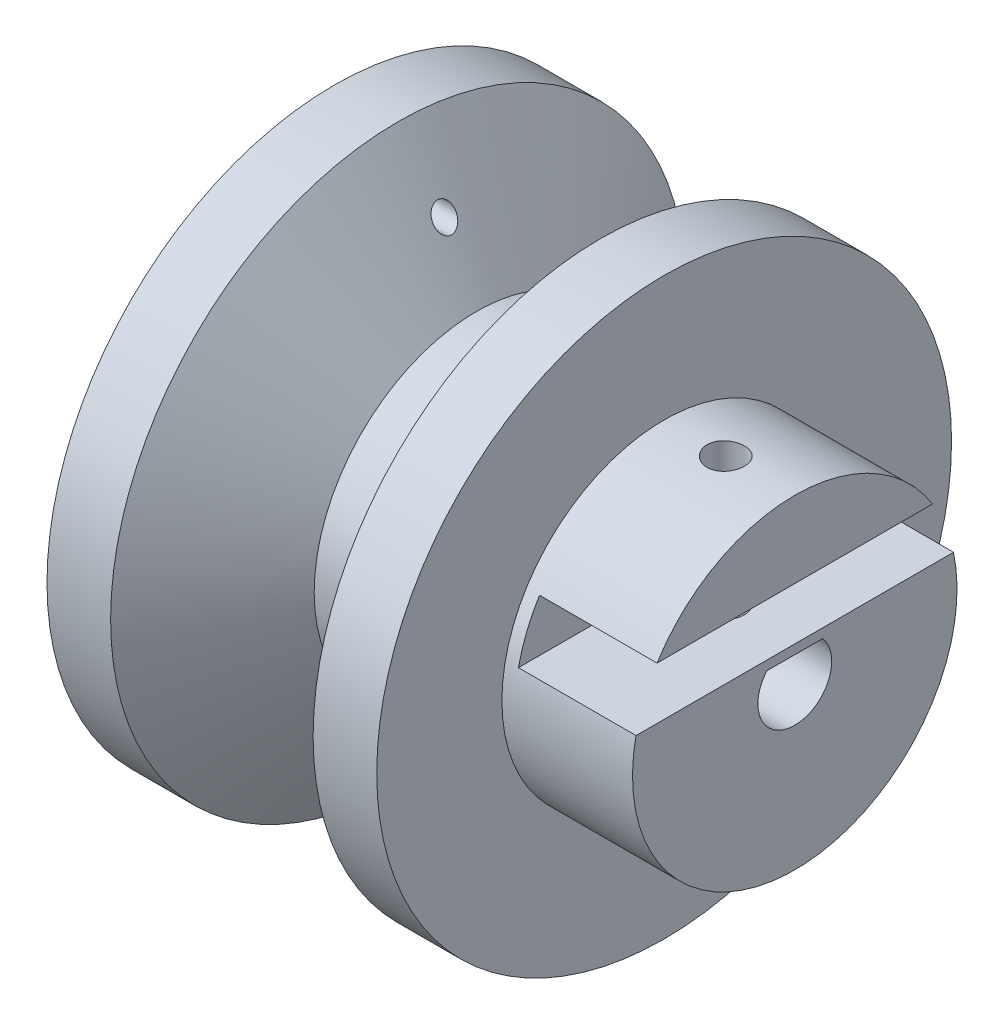
ISO-10303-21;
HEADER;
FILE_DESCRIPTION(('STEP AP214'),'2;1');
FILE_NAME('part.step','',(''),(''),'','','');
FILE_SCHEMA(('AUTOMOTIVE_DESIGN { 1 0 10303 214 1 1 1 1 }'));
ENDSEC;
DATA;
#1=APPLICATION_CONTEXT('core data for automotive mechanical design processes');
#2=APPLICATION_PROTOCOL_DEFINITION('international standard','automotive_design',2000,#1);
#3=PRODUCT_CONTEXT('',#1,'mechanical');
#4=PRODUCT('Part','Part','',(#3));
#5=PRODUCT_RELATED_PRODUCT_CATEGORY('part','',(#4));
#6=PRODUCT_DEFINITION_FORMATION('','',#4);
#7=PRODUCT_DEFINITION_CONTEXT('part definition',#1,'design');
#8=PRODUCT_DEFINITION('design','',#6,#7);
#9=PRODUCT_DEFINITION_SHAPE('','',#8);
#10=(LENGTH_UNIT() NAMED_UNIT(*) SI_UNIT(.MILLI.,.METRE.));
#11=(NAMED_UNIT(*) PLANE_ANGLE_UNIT() SI_UNIT($,.RADIAN.));
#12=(NAMED_UNIT(*) SI_UNIT($,.STERADIAN.) SOLID_ANGLE_UNIT());
#13=UNCERTAINTY_MEASURE_WITH_UNIT(LENGTH_MEASURE(1.E-05),#10,'distance_accuracy_value','');
#14=(GEOMETRIC_REPRESENTATION_CONTEXT(3) GLOBAL_UNCERTAINTY_ASSIGNED_CONTEXT((#13)) GLOBAL_UNIT_ASSIGNED_CONTEXT((#10,
#11,#12)) REPRESENTATION_CONTEXT('',''));
#15=CARTESIAN_POINT('',(0.,0.,0.));
#16=DIRECTION('',(0.,0.,1.));
#17=DIRECTION('',(1.,0.,0.));
#18=AXIS2_PLACEMENT_3D('',#15,#16,#17);
#19=CARTESIAN_POINT('',(35.24,12.4188584474886,0.));
#20=DIRECTION('',(-1.,0.,0.));
#21=DIRECTION('',(0.,0.,1.));
#22=AXIS2_PLACEMENT_3D('',#19,#20,#21);
#23=PLANE('',#22);
#24=DIRECTION('',(0.,0.,-1.));
#25=VECTOR('',#24,1.);
#26=CARTESIAN_POINT('',(35.24,1.85097792377277,2.60998384332674));
#27=LINE('',#26,#25);
#28=CARTESIAN_POINT('',(35.24,1.85097792377277,2.13412879782497));
#29=VERTEX_POINT('',#28);
#30=CARTESIAN_POINT('',(35.24,1.85097792377277,-2.13412879782497));
#31=VERTEX_POINT('',#30);
#32=EDGE_CURVE('E115',#29,#31,#27,.T.);
#33=ORIENTED_EDGE('',*,*,#32,.T.);
#34=CARTESIAN_POINT('',(35.24,0.,0.));
#35=DIRECTION('',(1.,0.,0.));
#36=DIRECTION('',(0.,0.,-1.));
#37=AXIS2_PLACEMENT_3D('',#34,#35,#36);
#38=CIRCLE('',#37,2.825);
#39=EDGE_CURVE('E128',#29,#31,#38,.T.);
#40=ORIENTED_EDGE('',*,*,#39,.F.);
#41=EDGE_LOOP('',(#33,#40));
#42=FACE_BOUND('',#41,.T.);
#43=CARTESIAN_POINT('',(35.2400000000001,0.,0.));
#44=DIRECTION('',(-1.,0.,0.));
#45=DIRECTION('',(0.,0.,1.));
#46=AXIS2_PLACEMENT_3D('',#43,#44,#45);
#47=CIRCLE('',#46,12.4188584474886);
#48=CARTESIAN_POINT('',(35.24,2.5651086710594,-12.1510601448769));
#49=VERTEX_POINT('',#48);
#50=CARTESIAN_POINT('',(35.24,2.5651086710594,12.1510601448769));
#51=VERTEX_POINT('',#50);
#52=EDGE_CURVE('E107',#49,#51,#47,.T.);
#53=ORIENTED_EDGE('',*,*,#52,.F.);
#54=DIRECTION('',(0.,0.,-1.));
#55=VECTOR('',#54,1.);
#56=CARTESIAN_POINT('',(35.24,2.5651086710594,12.1510601448769));
#57=LINE('',#56,#55);
#58=EDGE_CURVE('E197',#51,#49,#57,.T.);
#59=ORIENTED_EDGE('',*,*,#58,.F.);
#60=EDGE_LOOP('',(#53,#59));
#61=FACE_BOUND('',#60,.T.);
#62=ADVANCED_FACE('F32',(#42,#61),#23,.F.);
#63=CARTESIAN_POINT('',(0.,0.,0.));
#64=DIRECTION('',(1.,0.,0.));
#65=DIRECTION('',(0.,0.,-1.));
#66=AXIS2_PLACEMENT_3D('',#63,#64,#65);
#67=PLANE('',#66);
#68=CARTESIAN_POINT('',(0.,17.0038882596721,-0.435299539447605));
#69=DIRECTION('',(-1.,0.,0.));
#70=DIRECTION('',(0.,0.,1.));
#71=AXIS2_PLACEMENT_3D('',#68,#69,#70);
#72=CIRCLE('',#71,0.877374271185562);
#73=CARTESIAN_POINT('',(0.,17.0038882596721,0.442074731737957));
#74=VERTEX_POINT('',#73);
#75=EDGE_CURVE('E119',#74,#74,#72,.T.);
#76=ORIENTED_EDGE('',*,*,#75,.F.);
#77=EDGE_LOOP('',(#76));
#78=FACE_BOUND('',#77,.T.);
#79=CARTESIAN_POINT('',(0.,0.,0.));
#80=DIRECTION('',(-1.,0.,0.));
#81=DIRECTION('',(0.,0.,1.));
#82=AXIS2_PLACEMENT_3D('',#79,#80,#81);
#83=CIRCLE('',#82,22.);
#84=CARTESIAN_POINT('',(0.,0.,22.));
#85=VERTEX_POINT('',#84);
#86=EDGE_CURVE('E150',#85,#85,#83,.T.);
#87=ORIENTED_EDGE('',*,*,#86,.T.);
#88=EDGE_LOOP('',(#87));
#89=FACE_BOUND('',#88,.T.);
#90=ADVANCED_FACE('F34',(#78,#89),#67,.F.);
#91=CARTESIAN_POINT('',(-743.156397809563,0.,0.));
#92=DIRECTION('',(-1.,0.,0.));
#93=DIRECTION('',(0.,0.,1.));
#94=AXIS2_PLACEMENT_3D('',#91,#92,#93);
#95=CYLINDRICAL_SURFACE('',#94,22.);
#96=ORIENTED_EDGE('',*,*,#86,.F.);
#97=EDGE_LOOP('',(#96));
#98=FACE_BOUND('',#97,.T.);
#99=CARTESIAN_POINT('',(4.87000000000004,0.,0.));
#100=DIRECTION('',(-1.,0.,0.));
#101=DIRECTION('',(0.,0.,1.));
#102=AXIS2_PLACEMENT_3D('',#99,#100,#101);
#103=CIRCLE('',#102,22.);
#104=CARTESIAN_POINT('',(4.87000000000004,0.,22.));
#105=VERTEX_POINT('',#104);
#106=EDGE_CURVE('E147',#105,#105,#103,.T.);
#107=ORIENTED_EDGE('',*,*,#106,.T.);
#108=EDGE_LOOP('',(#107));
#109=FACE_BOUND('',#108,.T.);
#110=ADVANCED_FACE('F226',(#98,#109),#95,.T.);
#111=CARTESIAN_POINT('',(10.87,0.,0.));
#112=DIRECTION('',(-1.,0.,0.));
#113=DIRECTION('',(0.,0.,1.));
#114=AXIS2_PLACEMENT_3D('',#111,#112,#113);
#115=CONICAL_SURFACE('',#114,12.4188584474886,1.01131287661841);
#116=CARTESIAN_POINT('',(7.57710064935121,17.6469899885848,-1.0321293125052));
#117=CARTESIAN_POINT('',(7.59858696970687,17.6103093572041,-1.07165012340615));
#118=CARTESIAN_POINT('',(7.62208547211646,17.570493891253,-1.10722647006451));
#119=CARTESIAN_POINT('',(7.67211574976536,17.4863575017174,-1.16999423439249));
#120=CARTESIAN_POINT('',(7.69865373989293,17.4420273681804,-1.19716803614218));
#121=CARTESIAN_POINT('',(7.7537178680254,17.3506790615454,-1.24283461884535));
#122=CARTESIAN_POINT('',(7.7822317512725,17.3036777343423,-1.26137621827307));
#123=CARTESIAN_POINT('',(7.84063094326776,17.2080482814304,-1.29004924996073));
#124=CARTESIAN_POINT('',(7.87051579202427,17.1594207028306,-1.30018348162644));
#125=CARTESIAN_POINT('',(7.9345889447417,17.0558396084734,-1.31286398770481));
#126=CARTESIAN_POINT('',(7.96886969232172,17.0008153123109,-1.31437651309146));
#127=CARTESIAN_POINT('',(8.0375102749212,16.8914365160545,-1.30716416879393));
#128=CARTESIAN_POINT('',(8.07187015314245,16.8370826542982,-1.2984302048489));
#129=CARTESIAN_POINT('',(8.14175788271561,16.7273328415289,-1.26998626133393));
#130=CARTESIAN_POINT('',(8.17723632786973,16.6720622102294,-1.24966357055881));
#131=CARTESIAN_POINT('',(8.24606670152021,16.565678611003,-1.19770038677462));
#132=CARTESIAN_POINT('',(8.27942078309851,16.5145614185143,-1.16607157492409));
#133=CARTESIAN_POINT('',(8.33585911246015,16.428780982538,-1.09962176736246));
#134=CARTESIAN_POINT('',(8.35961996463377,16.392928982425,-1.0669056020117));
#135=CARTESIAN_POINT('',(8.40409237990411,16.3263132496161,-0.994836558175923));
#136=CARTESIAN_POINT('',(8.42480501157602,16.2955477333484,-0.955486015847686));
#137=CARTESIAN_POINT('',(8.46234495671956,16.2402844415044,-0.870373471187866));
#138=CARTESIAN_POINT('',(8.47913899447736,16.2158401675624,-0.824561508898873));
#139=CARTESIAN_POINT('',(8.50751309777022,16.1751081791058,-0.727953349369449));
#140=CARTESIAN_POINT('',(8.51909933119994,16.1588108131707,-0.677163135495156));
#141=CARTESIAN_POINT('',(8.53488094318649,16.1373447706426,-0.580161290511711));
#142=CARTESIAN_POINT('',(8.53990959326869,16.1308968261673,-0.534366853182571));
#143=CARTESIAN_POINT('',(8.54514520828514,16.1253259133949,-0.442070829258393));
#144=CARTESIAN_POINT('',(8.54535555018206,16.1261978143204,-0.395569760787498));
#145=CARTESIAN_POINT('',(8.541173254549,16.1347714102407,-0.308212439494241));
#146=CARTESIAN_POINT('',(8.53724514153672,16.1417716835689,-0.267261878949982));
#147=CARTESIAN_POINT('',(8.52572113922937,16.1613015180637,-0.187249414051404));
#148=CARTESIAN_POINT('',(8.51812522544573,16.1738311161475,-0.148187522308952));
#149=CARTESIAN_POINT('',(8.49946671631706,16.2041463988323,-0.0721051969150272));
#150=CARTESIAN_POINT('',(8.48833748769769,16.2220327014612,-0.0351416028744495));
#151=CARTESIAN_POINT('',(8.46316519283135,16.2622293004421,0.0352008745332211));
#152=CARTESIAN_POINT('',(8.44912110231585,16.2845411517882,0.0685784915312397));
#153=CARTESIAN_POINT('',(8.41687995595704,16.3356201580455,0.134920692963254));
#154=CARTESIAN_POINT('',(8.39839123806896,16.3648343176043,0.167398069752422));
#155=CARTESIAN_POINT('',(8.35909075464078,16.4268787201235,0.227045166224027));
#156=CARTESIAN_POINT('',(8.33827774400546,16.4597109010879,0.254212019485613));
#157=CARTESIAN_POINT('',(8.29144308012003,16.5336181920161,0.307000212991373));
#158=CARTESIAN_POINT('',(8.26512022814534,16.5751726474867,0.331683259220349));
#159=CARTESIAN_POINT('',(8.21089391937303,16.6608928082891,0.373663246172801));
#160=CARTESIAN_POINT('',(8.18298954721767,16.7050600265054,0.390955858954056));
#161=CARTESIAN_POINT('',(8.12201915890138,16.8017439443856,0.420175566971032));
#162=CARTESIAN_POINT('',(8.08880293035609,16.8545251252543,0.430921399006398));
#163=CARTESIAN_POINT('',(8.02199430711081,16.9609411585357,0.442658189173514));
#164=CARTESIAN_POINT('',(7.98840172781309,17.0145764358469,0.443644129778204));
#165=CARTESIAN_POINT('',(7.91896479247929,17.1257041049629,0.435500590064853));
#166=CARTESIAN_POINT('',(7.88315557748009,17.1831613604048,0.425554610851169));
#167=CARTESIAN_POINT('',(7.81305828477654,17.2958753262745,0.394129215887979));
#168=CARTESIAN_POINT('',(7.77877078551657,17.3511311990956,0.372645454294588));
#169=CARTESIAN_POINT('',(7.71379193642469,17.4559806321318,0.318872018137825));
#170=CARTESIAN_POINT('',(7.68302779815533,17.5056878491033,0.28689452421742));
#171=CARTESIAN_POINT('',(7.62533406909833,17.5988866125941,0.212242419926597));
#172=CARTESIAN_POINT('',(7.59839716090936,17.6423900209737,0.16958866531187));
#173=CARTESIAN_POINT('',(7.5564280952465,17.7099770138339,0.0874194493949479));
#174=CARTESIAN_POINT('',(7.54015272745725,17.7361211723733,0.05022045362308));
#175=CARTESIAN_POINT('',(7.51098112956783,17.7827514763873,-0.0287820108125972));
#176=CARTESIAN_POINT('',(7.49808283855765,17.8032410730546,-0.070582649027154));
#177=CARTESIAN_POINT('',(7.47619126189893,17.8376387364044,-0.158053701708577));
#178=CARTESIAN_POINT('',(7.46721856973529,17.8515121282323,-0.203743056567755));
#179=CARTESIAN_POINT('',(7.45376732766192,17.8716796013603,-0.297406287042948));
#180=CARTESIAN_POINT('',(7.44928674611258,17.877977109251,-0.345379119621681));
#181=CARTESIAN_POINT('',(7.44527865397654,17.8823537747537,-0.437381731517052));
#182=CARTESIAN_POINT('',(7.44532706194515,17.8811465326982,-0.481360625106139));
#183=CARTESIAN_POINT('',(7.44932520956757,17.8722015880745,-0.568465213747448));
#184=CARTESIAN_POINT('',(7.45327455246623,17.8644645496485,-0.611590995112756));
#185=CARTESIAN_POINT('',(7.46471441193906,17.8431470686332,-0.694558804795008));
#186=CARTESIAN_POINT('',(7.47210323596792,17.8297353786481,-0.7344588381032));
#187=CARTESIAN_POINT('',(7.49006154336463,17.7976971406007,-0.811311988945838));
#188=CARTESIAN_POINT('',(7.50062971839938,17.7790727378383,-0.848266310770904));
#189=CARTESIAN_POINT('',(7.52181145146751,17.7421114658881,-0.910491405001787));
#190=CARTESIAN_POINT('',(7.53186311145677,17.7246808783704,-0.936502677841586));
#191=CARTESIAN_POINT('',(7.55342859947495,17.687498164192,-0.986140126297638));
#192=CARTESIAN_POINT('',(7.5649424808183,17.6677459528839,-1.00976621489066));
#193=CARTESIAN_POINT('',(7.57710064935121,17.6469899885848,-1.0321293125052));
#194=B_SPLINE_CURVE_WITH_KNOTS('',3,(#116,#117,#118,#119,#120,#121,#122,#123,#124,#125,#126,
#127,#128,#129,#130,#131,#132,#133,#134,#135,#136,#137,#138,#139,#140,#141,#142,#143,#144,#145,
#146,#147,#148,#149,#150,#151,#152,#153,#154,#155,#156,#157,#158,#159,#160,#161,#162,#163,#164,
#165,#166,#167,#168,#169,#170,#171,#172,#173,#174,#175,#176,#177,#178,#179,#180,#181,#182,#183,
#184,#185,#186,#187,#188,#189,#190,#191,#192,#193),.UNSPECIFIED.,.T.,.F.,(4,2,2,2,2,2,2,2,2,2,2,
2,2,2,2,2,2,2,2,2,2,2,2,2,2,2,2,2,2,2,2,2,2,2,2,2,2,2,4),(0.,0.173996351568271,
0.348355050897355,0.521715332761506,0.695017867564551,0.888722524279778,1.08259923350639,
1.28782754899418,1.49284443845302,1.65431677774408,1.8157323762386,1.97847247612174,
2.1410193226121,2.27978647529783,2.41845636856715,2.54306680311651,2.66767806965562,
2.79479488196885,2.92195643837835,3.06371467017267,3.20554920772108,3.37001542430504,
3.53457782309115,3.72362696343585,3.91277328825767,4.11706890577917,4.32144152771644,
4.52021486035198,4.71860288500816,4.86288734801061,5.00708355300821,5.15202738932061,
5.29690564250678,5.42823286153829,5.55954672495499,5.68720322986764,5.81480727460697,
5.91326060580393,6.01171752776455),.UNSPECIFIED.);
#195=CARTESIAN_POINT('',(7.57710064935121,17.6469899885848,-1.0321293125052));
#196=VERTEX_POINT('',#195);
#197=EDGE_CURVE('E124',#196,#196,#194,.T.);
#198=ORIENTED_EDGE('',*,*,#197,.T.);
#199=EDGE_LOOP('',(#198));
#200=FACE_BOUND('',#199,.T.);
#201=ORIENTED_EDGE('',*,*,#106,.F.);
#202=EDGE_LOOP('',(#201));
#203=FACE_BOUND('',#202,.T.);
#204=CARTESIAN_POINT('',(10.87,0.,0.));
#205=DIRECTION('',(-1.,0.,0.));
#206=DIRECTION('',(0.,0.,1.));
#207=AXIS2_PLACEMENT_3D('',#204,#205,#206);
#208=CIRCLE('',#207,12.4188584474886);
#209=CARTESIAN_POINT('',(10.87,0.,12.4188584474886));
#210=VERTEX_POINT('',#209);
#211=EDGE_CURVE('E144',#210,#210,#208,.T.);
#212=ORIENTED_EDGE('',*,*,#211,.T.);
#213=EDGE_LOOP('',(#212));
#214=FACE_BOUND('',#213,.T.);
#215=ADVANCED_FACE('F160',(#200,#203,#214),#115,.T.);
#216=CARTESIAN_POINT('',(-743.156397809563,0.,0.));
#217=DIRECTION('',(-1.,0.,0.));
#218=DIRECTION('',(0.,0.,1.));
#219=AXIS2_PLACEMENT_3D('',#216,#217,#218);
#220=CYLINDRICAL_SURFACE('',#219,12.4188584474886);
#221=ORIENTED_EDGE('',*,*,#211,.F.);
#222=EDGE_LOOP('',(#221));
#223=FACE_BOUND('',#222,.T.);
#224=CARTESIAN_POINT('',(14.37,0.,0.));
#225=DIRECTION('',(-1.,0.,0.));
#226=DIRECTION('',(0.,0.,1.));
#227=AXIS2_PLACEMENT_3D('',#224,#225,#226);
#228=CIRCLE('',#227,12.4188584474886);
#229=CARTESIAN_POINT('',(14.37,0.,12.4188584474886));
#230=VERTEX_POINT('',#229);
#231=EDGE_CURVE('E141',#230,#230,#228,.T.);
#232=ORIENTED_EDGE('',*,*,#231,.T.);
#233=EDGE_LOOP('',(#232));
#234=FACE_BOUND('',#233,.T.);
#235=ADVANCED_FACE('F254',(#223,#234),#220,.T.);
#236=CARTESIAN_POINT('',(20.37,0.,0.));
#237=DIRECTION('',(1.,0.,0.));
#238=DIRECTION('',(0.,0.,-1.));
#239=AXIS2_PLACEMENT_3D('',#236,#237,#238);
#240=CONICAL_SURFACE('',#239,22.,1.01131287661841);
#241=ORIENTED_EDGE('',*,*,#231,.F.);
#242=EDGE_LOOP('',(#241));
#243=FACE_BOUND('',#242,.T.);
#244=CARTESIAN_POINT('',(20.37,0.,0.));
#245=DIRECTION('',(-1.,0.,0.));
#246=DIRECTION('',(0.,0.,1.));
#247=AXIS2_PLACEMENT_3D('',#244,#245,#246);
#248=CIRCLE('',#247,22.);
#249=CARTESIAN_POINT('',(20.37,0.,22.));
#250=VERTEX_POINT('',#249);
#251=EDGE_CURVE('E138',#250,#250,#248,.T.);
#252=ORIENTED_EDGE('',*,*,#251,.T.);
#253=EDGE_LOOP('',(#252));
#254=FACE_BOUND('',#253,.T.);
#255=ADVANCED_FACE('F260',(#243,#254),#240,.T.);
#256=CARTESIAN_POINT('',(-743.156397809563,0.,0.));
#257=DIRECTION('',(-1.,0.,0.));
#258=DIRECTION('',(0.,0.,1.));
#259=AXIS2_PLACEMENT_3D('',#256,#257,#258);
#260=CYLINDRICAL_SURFACE('',#259,22.);
#261=ORIENTED_EDGE('',*,*,#251,.F.);
#262=EDGE_LOOP('',(#261));
#263=FACE_BOUND('',#262,.T.);
#264=CARTESIAN_POINT('',(25.24,0.,0.));
#265=DIRECTION('',(-1.,0.,0.));
#266=DIRECTION('',(0.,0.,1.));
#267=AXIS2_PLACEMENT_3D('',#264,#265,#266);
#268=CIRCLE('',#267,22.);
#269=CARTESIAN_POINT('',(25.24,0.,22.));
#270=VERTEX_POINT('',#269);
#271=EDGE_CURVE('E135',#270,#270,#268,.T.);
#272=ORIENTED_EDGE('',*,*,#271,.T.);
#273=EDGE_LOOP('',(#272));
#274=FACE_BOUND('',#273,.T.);
#275=ADVANCED_FACE('F265',(#263,#274),#260,.T.);
#276=CARTESIAN_POINT('',(25.24,22.,0.));
#277=DIRECTION('',(-1.,0.,0.));
#278=DIRECTION('',(0.,0.,1.));
#279=AXIS2_PLACEMENT_3D('',#276,#277,#278);
#280=PLANE('',#279);
#281=ORIENTED_EDGE('',*,*,#271,.F.);
#282=EDGE_LOOP('',(#281));
#283=FACE_BOUND('',#282,.T.);
#284=CARTESIAN_POINT('',(25.24,0.,0.));
#285=DIRECTION('',(-1.,0.,0.));
#286=DIRECTION('',(0.,0.,1.));
#287=AXIS2_PLACEMENT_3D('',#284,#285,#286);
#288=CIRCLE('',#287,12.4188584474886);
#289=CARTESIAN_POINT('',(25.24,0.,12.4188584474886));
#290=VERTEX_POINT('',#289);
#291=EDGE_CURVE('E132',#290,#290,#288,.T.);
#292=ORIENTED_EDGE('',*,*,#291,.T.);
#293=EDGE_LOOP('',(#292));
#294=FACE_BOUND('',#293,.T.);
#295=ADVANCED_FACE('F186',(#283,#294),#280,.F.);
#296=CARTESIAN_POINT('',(-743.156397809563,0.,0.));
#297=DIRECTION('',(-1.,0.,0.));
#298=DIRECTION('',(0.,0.,1.));
#299=AXIS2_PLACEMENT_3D('',#296,#297,#298);
#300=CYLINDRICAL_SURFACE('',#299,12.4188584474886);
#301=CARTESIAN_POINT('',(29.9566790366801,12.3362532860978,1.43));
#302=CARTESIAN_POINT('',(29.8766415005929,12.3362543547786,1.42999656856282));
#303=CARTESIAN_POINT('',(29.7965527205576,12.337040614633,1.42325775580059));
#304=CARTESIAN_POINT('',(29.6386005099741,12.3400998285692,1.39647984717818));
#305=CARTESIAN_POINT('',(29.560739551138,12.3423743718286,1.37642653385869));
#306=CARTESIAN_POINT('',(29.4095529500731,12.3481491792855,1.32361556439335));
#307=CARTESIAN_POINT('',(29.3362244036367,12.3516486488102,1.29086614338773));
#308=CARTESIAN_POINT('',(29.1961189155259,12.3594780416116,1.21360950001742));
#309=CARTESIAN_POINT('',(29.1293407809569,12.3638078132561,1.16910442394488));
#310=CARTESIAN_POINT('',(29.0038984841717,12.3728330944587,1.0693720983649));
#311=CARTESIAN_POINT('',(28.9452700602216,12.3775300820036,1.01410002665938));
#312=CARTESIAN_POINT('',(28.8380997553538,12.3867472249905,0.894498941623689));
#313=CARTESIAN_POINT('',(28.789558358981,12.3912673719293,0.830169493458311));
#314=CARTESIAN_POINT('',(28.7038135297629,12.399636476801,0.694057167605042));
#315=CARTESIAN_POINT('',(28.6666421797863,12.4034835226061,0.622253951537439));
#316=CARTESIAN_POINT('',(28.6048979823377,12.4100567816884,0.4733728662726));
#317=CARTESIAN_POINT('',(28.5803247349604,12.4127830305429,0.396295164593024));
#318=CARTESIAN_POINT('',(28.5445803486089,12.4167971240277,0.239417075879076));
#319=CARTESIAN_POINT('',(28.5333500368879,12.418091317713,0.159630336290916));
#320=CARTESIAN_POINT('',(28.5244270468968,12.4191171273432,-0.000705158918776726));
#321=CARTESIAN_POINT('',(28.5267339122567,12.4188487959643,-0.0812538887604282));
#322=CARTESIAN_POINT('',(28.5447721160121,12.4167849503152,-0.240424668881091));
#323=CARTESIAN_POINT('',(28.5604398207387,12.4149966752137,-0.319054037544488));
#324=CARTESIAN_POINT('',(28.6046556245593,12.4101020764272,-0.472559837527985));
#325=CARTESIAN_POINT('',(28.6332039366492,12.4069957309462,-0.547436206765125));
#326=CARTESIAN_POINT('',(28.7024391239357,12.3998016290938,-0.691509049339068));
#327=CARTESIAN_POINT('',(28.7431537974654,12.3957116294405,-0.760692047436578));
#328=CARTESIAN_POINT('',(28.8355457634506,12.3870083772064,-0.891267283271419));
#329=CARTESIAN_POINT('',(28.887223482655,12.3823951042599,-0.952659217584102));
#330=CARTESIAN_POINT('',(29.0004316281959,12.3731306027272,-1.06628301025639));
#331=CARTESIAN_POINT('',(29.062017470425,12.3684793092033,-1.11845966574371));
#332=CARTESIAN_POINT('',(29.1931025622041,12.3596895263662,-1.21174345850806));
#333=CARTESIAN_POINT('',(29.2626018302803,12.3555510382537,-1.25285056986917));
#334=CARTESIAN_POINT('',(29.4075872845754,12.34825534089,-1.32283010542235));
#335=CARTESIAN_POINT('',(29.4830754165496,12.3450984522086,-1.35169853383604));
#336=CARTESIAN_POINT('',(29.6378721472964,12.3401298226392,-1.39633450535049));
#337=CARTESIAN_POINT('',(29.7171805905079,12.338318027029,-1.41210258141485));
#338=CARTESIAN_POINT('',(29.8768803526176,12.3362545323326,-1.43001802714866));
#339=CARTESIAN_POINT('',(29.9572628678513,12.3359939573524,-1.43224289106962));
#340=CARTESIAN_POINT('',(30.1172555077615,12.3370389573677,-1.42321282684733));
#341=CARTESIAN_POINT('',(30.1968656463278,12.3383445041463,-1.41195814156634));
#342=CARTESIAN_POINT('',(30.3528241361659,12.3423665588411,-1.37635353486341));
#343=CARTESIAN_POINT('',(30.4291810814328,12.3450790629145,-1.3520407664997));
#344=CARTESIAN_POINT('',(30.5767338212551,12.3516061597655,-1.29104825483859));
#345=CARTESIAN_POINT('',(30.6479294606197,12.3554207856647,-1.2543681398657));
#346=CARTESIAN_POINT('',(30.7834903157623,12.3637436770634,-1.16949010572205));
#347=CARTESIAN_POINT('',(30.8478233822978,12.3682549841025,-1.12124114319495));
#348=CARTESIAN_POINT('',(30.9675057311487,12.3774532174444,-1.0146676008058));
#349=CARTESIAN_POINT('',(31.0228547176425,12.3821401495237,-0.956342689300289));
#350=CARTESIAN_POINT('',(31.1232678820979,12.3911886106236,-0.830935328947663));
#351=CARTESIAN_POINT('',(31.1682812921018,12.3955484654198,-0.763812092520508));
#352=CARTESIAN_POINT('',(31.2463950731633,12.4034267907236,-0.62291311551262));
#353=CARTESIAN_POINT('',(31.2794956527181,12.4069452759565,-0.5491374913895));
#354=CARTESIAN_POINT('',(31.3327594111847,12.4127369447811,-0.39720022342704));
#355=CARTESIAN_POINT('',(31.352952484063,12.4150130040488,-0.319049173459893));
#356=CARTESIAN_POINT('',(31.3799254101379,12.4180752568925,-0.160438031715975));
#357=CARTESIAN_POINT('',(31.3867057721205,12.4188615069815,-0.079978027642504));
#358=CARTESIAN_POINT('',(31.3866522960714,12.4188553872906,0.080470132684622));
#359=CARTESIAN_POINT('',(31.3798969592036,12.4180721200269,0.160458326904769));
#360=CARTESIAN_POINT('',(31.353129414214,12.4150329995037,0.318154959216969));
#361=CARTESIAN_POINT('',(31.3331172061934,12.4127771462553,0.395863397326423));
#362=CARTESIAN_POINT('',(31.2804274596287,12.4070453387419,0.546788376183934));
#363=CARTESIAN_POINT('',(31.2477530796731,12.4035696887765,0.620006031889464));
#364=CARTESIAN_POINT('',(31.170674655755,12.3957842255844,0.759930918913533));
#365=CARTESIAN_POINT('',(31.1262705587373,12.3914744085848,0.826638120782493));
#366=CARTESIAN_POINT('',(31.0267008250557,12.382472558647,0.952050277673897));
#367=CARTESIAN_POINT('',(30.9714767050552,12.3777785331082,1.01070865942204));
#368=CARTESIAN_POINT('',(30.8519542768085,12.3685537016945,1.11795793827958));
#369=CARTESIAN_POINT('',(30.7876538117294,12.3640229349372,1.16654643566554));
#370=CARTESIAN_POINT('',(30.651564715716,12.3556216955113,1.25240994252094));
#371=CARTESIAN_POINT('',(30.5797521181833,12.3517534468431,1.28964716100665));
#372=CARTESIAN_POINT('',(30.4308911513741,12.3451414058875,1.3514823741385));
#373=CARTESIAN_POINT('',(30.3538486727825,12.342396372185,1.37609433032744));
#374=CARTESIAN_POINT('',(30.2231057860008,12.3390189734802,1.40598438059397));
#375=CARTESIAN_POINT('',(30.1702350524939,12.3379868951945,1.41497756071935));
#376=CARTESIAN_POINT('',(30.0638102095147,12.3366036958795,1.42698650081228));
#377=CARTESIAN_POINT('',(30.0102561041853,12.3362525707237,1.43000229700151));
#378=CARTESIAN_POINT('',(29.9566790366801,12.3362532860978,1.43));
#379=B_SPLINE_CURVE_WITH_KNOTS('',3,(#301,#302,#303,#304,#305,#306,#307,#308,#309,#310,#311,
#312,#313,#314,#315,#316,#317,#318,#319,#320,#321,#322,#323,#324,#325,#326,#327,#328,#329,#330,
#331,#332,#333,#334,#335,#336,#337,#338,#339,#340,#341,#342,#343,#344,#345,#346,#347,#348,#349,
#350,#351,#352,#353,#354,#355,#356,#357,#358,#359,#360,#361,#362,#363,#364,#365,#366,#367,#368,
#369,#370,#371,#372,#373,#374,#375,#376,#377,#378),.UNSPECIFIED.,.T.,.F.,(4,2,2,2,2,2,2,2,2,2,2,
2,2,2,2,2,2,2,2,2,2,2,2,2,2,2,2,2,2,2,2,2,2,2,2,2,2,2,4),(0.,0.239916913702954,
0.480090427837701,0.720108416967034,0.960082614995103,1.20107802192179,1.44208500273427,
1.68376588981299,1.92543910466615,2.16603650751635,2.40662579930954,2.64607559540223,
2.88552935122082,3.125534462088,3.36554891713905,3.60695567987138,3.84836300777811,
4.08984909160267,4.33132535053148,4.57141857366965,4.81150747109134,5.05091685485733,
5.29033343422751,5.53082644682554,5.77132737660689,6.01298550424868,6.25463940221113,
6.49573157888082,6.73681460999635,6.97650351135201,7.21619241087806,7.45582155827169,
7.6954517895606,7.93641487526541,8.17743531828661,8.41924962356345,8.6607959408636,
8.82139711879876,8.98199732352164),.UNSPECIFIED.);
#380=CARTESIAN_POINT('',(29.9566790366801,12.3362532860978,1.43));
#381=VERTEX_POINT('',#380);
#382=EDGE_CURVE('E190',#381,#381,#379,.T.);
#383=ORIENTED_EDGE('',*,*,#382,.T.);
#384=EDGE_LOOP('',(#383));
#385=FACE_BOUND('',#384,.T.);
#386=CARTESIAN_POINT('',(26.24,0.,0.));
#387=DIRECTION('',(1.,0.,0.));
#388=DIRECTION('',(0.,0.,-1.));
#389=AXIS2_PLACEMENT_3D('',#386,#387,#388);
#390=CIRCLE('',#389,12.4188584474886);
#391=CARTESIAN_POINT('',(26.24,2.5651086710594,-12.1510601448769));
#392=VERTEX_POINT('',#391);
#393=CARTESIAN_POINT('',(26.24,6.5651086710594,-10.5416978364939));
#394=VERTEX_POINT('',#393);
#395=EDGE_CURVE('E11',#392,#394,#390,.T.);
#396=ORIENTED_EDGE('',*,*,#395,.F.);
#397=DIRECTION('',(1.,0.,0.));
#398=VECTOR('',#397,1.);
#399=CARTESIAN_POINT('',(26.24,2.5651086710594,-12.1510601448769));
#400=LINE('',#399,#398);
#401=EDGE_CURVE('E101',#392,#49,#400,.T.);
#402=ORIENTED_EDGE('',*,*,#401,.T.);
#403=ORIENTED_EDGE('',*,*,#52,.T.);
#404=DIRECTION('',(1.,0.,0.));
#405=VECTOR('',#404,1.);
#406=CARTESIAN_POINT('',(26.24,2.5651086710594,12.1510601448769));
#407=LINE('',#406,#405);
#408=CARTESIAN_POINT('',(26.24,2.5651086710594,12.1510601448769));
#409=VERTEX_POINT('',#408);
#410=EDGE_CURVE('E98',#409,#51,#407,.T.);
#411=ORIENTED_EDGE('',*,*,#410,.F.);
#412=CARTESIAN_POINT('',(26.24,6.5651086710594,10.5416978364939));
#413=VERTEX_POINT('',#412);
#414=EDGE_CURVE('E41',#413,#409,#390,.T.);
#415=ORIENTED_EDGE('',*,*,#414,.F.);
#416=DIRECTION('',(-1.,0.,0.));
#417=VECTOR('',#416,1.);
#418=CARTESIAN_POINT('',(-743.156397809563,6.5651086710594,10.5416978364939));
#419=LINE('',#418,#417);
#420=CARTESIAN_POINT('',(35.24,6.5651086710594,10.5416978364939));
#421=VERTEX_POINT('',#420);
#422=EDGE_CURVE('E109',#413,#421,#419,.F.);
#423=ORIENTED_EDGE('',*,*,#422,.T.);
#424=CARTESIAN_POINT('',(35.2400000000001,6.5651086710594,-10.5416978364939));
#425=VERTEX_POINT('',#424);
#426=EDGE_CURVE('E131',#421,#425,#47,.T.);
#427=ORIENTED_EDGE('',*,*,#426,.T.);
#428=DIRECTION('',(-1.,0.,0.));
#429=VECTOR('',#428,1.);
#430=CARTESIAN_POINT('',(-743.156397809563,6.5651086710594,-10.5416978364939));
#431=LINE('',#430,#429);
#432=EDGE_CURVE('E48',#425,#394,#431,.T.);
#433=ORIENTED_EDGE('',*,*,#432,.T.);
#434=EDGE_LOOP('',(#396,#402,#403,#411,#415,#423,#427,#433));
#435=FACE_BOUND('',#434,.T.);
#436=ORIENTED_EDGE('',*,*,#291,.F.);
#437=EDGE_LOOP('',(#436));
#438=FACE_BOUND('',#437,.T.);
#439=ADVANCED_FACE('F104',(#385,#435,#438),#300,.T.);
#440=ORIENTED_EDGE('',*,*,#426,.F.);
#441=DIRECTION('',(0.,0.,-1.));
#442=VECTOR('',#441,1.);
#443=CARTESIAN_POINT('',(35.24,6.5651086710594,0.));
#444=LINE('',#443,#442);
#445=EDGE_CURVE('E95',#421,#425,#444,.T.);
#446=ORIENTED_EDGE('',*,*,#445,.T.);
#447=EDGE_LOOP('',(#440,#446));
#448=FACE_BOUND('',#447,.T.);
#449=ADVANCED_FACE('F178',(#448),#23,.F.);
#450=CARTESIAN_POINT('',(0.23999999999999,0.,0.));
#451=DIRECTION('',(1.,0.,0.));
#452=DIRECTION('',(0.,0.,-1.));
#453=AXIS2_PLACEMENT_3D('',#450,#451,#452);
#454=CYLINDRICAL_SURFACE('',#453,2.825);
#455=ORIENTED_EDGE('',*,*,#39,.T.);
#456=DIRECTION('',(1.,0.,0.));
#457=VECTOR('',#456,1.);
#458=CARTESIAN_POINT('',(0.23999999999999,1.85097792377277,-2.13412879782497));
#459=LINE('',#458,#457);
#460=CARTESIAN_POINT('',(5.23999999999999,1.85097792377277,-2.13412879782497));
#461=VERTEX_POINT('',#460);
#462=EDGE_CURVE('E232',#31,#461,#459,.F.);
#463=ORIENTED_EDGE('',*,*,#462,.T.);
#464=CARTESIAN_POINT('',(5.23999999999999,0.,0.));
#465=DIRECTION('',(1.,0.,0.));
#466=DIRECTION('',(0.,0.,-1.));
#467=AXIS2_PLACEMENT_3D('',#464,#465,#466);
#468=CIRCLE('',#467,2.825);
#469=CARTESIAN_POINT('',(5.23999999999999,1.85097792377277,2.13412879782497));
#470=VERTEX_POINT('',#469);
#471=EDGE_CURVE('E55',#470,#461,#468,.F.);
#472=ORIENTED_EDGE('',*,*,#471,.F.);
#473=DIRECTION('',(1.,0.,0.));
#474=VECTOR('',#473,1.);
#475=CARTESIAN_POINT('',(0.23999999999999,1.85097792377277,2.13412879782497));
#476=LINE('',#475,#474);
#477=EDGE_CURVE('E234',#470,#29,#476,.T.);
#478=ORIENTED_EDGE('',*,*,#477,.T.);
#479=EDGE_LOOP('',(#455,#463,#472,#478));
#480=FACE_BOUND('',#479,.T.);
#481=CARTESIAN_POINT('',(0.23999999999999,0.,0.));
#482=DIRECTION('',(1.,0.,0.));
#483=DIRECTION('',(0.,0.,-1.));
#484=AXIS2_PLACEMENT_3D('',#481,#482,#483);
#485=CIRCLE('',#484,2.825);
#486=CARTESIAN_POINT('',(0.23999999999999,0.,-2.825));
#487=VERTEX_POINT('',#486);
#488=EDGE_CURVE('E125',#487,#487,#485,.T.);
#489=ORIENTED_EDGE('',*,*,#488,.F.);
#490=EDGE_LOOP('',(#489));
#491=FACE_BOUND('',#490,.T.);
#492=ADVANCED_FACE('F174',(#480,#491),#454,.F.);
#493=CARTESIAN_POINT('',(0.23999999999999,0.,0.));
#494=DIRECTION('',(1.,0.,0.));
#495=DIRECTION('',(0.,0.,-1.));
#496=AXIS2_PLACEMENT_3D('',#493,#494,#495);
#497=PLANE('',#496);
#498=ORIENTED_EDGE('',*,*,#488,.T.);
#499=EDGE_LOOP('',(#498));
#500=FACE_BOUND('',#499,.T.);
#501=ADVANCED_FACE('F169',(#500),#497,.T.);
#502=CARTESIAN_POINT('',(12.,17.0038882596721,-0.435299539447605));
#503=DIRECTION('',(-1.,0.,0.));
#504=DIRECTION('',(0.,0.,1.));
#505=AXIS2_PLACEMENT_3D('',#502,#503,#504);
#506=CYLINDRICAL_SURFACE('',#505,0.877374271185562);
#507=ORIENTED_EDGE('',*,*,#75,.T.);
#508=EDGE_LOOP('',(#507));
#509=FACE_BOUND('',#508,.T.);
#510=ORIENTED_EDGE('',*,*,#197,.F.);
#511=EDGE_LOOP('',(#510));
#512=FACE_BOUND('',#511,.T.);
#513=ADVANCED_FACE('F163',(#509,#512),#506,.F.);
#514=CARTESIAN_POINT('',(5.23999999999999,1.85097792377277,2.60998384332674));
#515=DIRECTION('',(0.,-1.,0.));
#516=DIRECTION('',(0.,0.,-1.));
#517=AXIS2_PLACEMENT_3D('',#514,#515,#516);
#518=PLANE('',#517);
#519=CARTESIAN_POINT('',(29.9566790366801,1.85097792377277,0.));
#520=DIRECTION('',(0.,-1.,0.));
#521=DIRECTION('',(0.,0.,-1.));
#522=AXIS2_PLACEMENT_3D('',#519,#520,#521);
#523=CIRCLE('',#522,1.43);
#524=CARTESIAN_POINT('',(29.9566790366801,1.85097792377277,-1.43));
#525=VERTEX_POINT('',#524);
#526=EDGE_CURVE('E198',#525,#525,#523,.T.);
#527=ORIENTED_EDGE('',*,*,#526,.F.);
#528=EDGE_LOOP('',(#527));
#529=FACE_BOUND('',#528,.T.);
#530=ORIENTED_EDGE('',*,*,#462,.F.);
#531=ORIENTED_EDGE('',*,*,#32,.F.);
#532=ORIENTED_EDGE('',*,*,#477,.F.);
#533=DIRECTION('',(0.,0.,-1.));
#534=VECTOR('',#533,1.);
#535=CARTESIAN_POINT('',(5.23999999999999,1.85097792377277,2.60998384332674));
#536=LINE('',#535,#534);
#537=EDGE_CURVE('E116',#470,#461,#536,.T.);
#538=ORIENTED_EDGE('',*,*,#537,.T.);
#539=EDGE_LOOP('',(#530,#531,#532,#538));
#540=FACE_BOUND('',#539,.T.);
#541=ADVANCED_FACE('F168',(#529,#540),#518,.T.);
#542=CARTESIAN_POINT('',(5.23999999999999,0.,0.));
#543=DIRECTION('',(1.,0.,0.));
#544=DIRECTION('',(0.,0.,-1.));
#545=AXIS2_PLACEMENT_3D('',#542,#543,#544);
#546=PLANE('',#545);
#547=ORIENTED_EDGE('',*,*,#471,.T.);
#548=ORIENTED_EDGE('',*,*,#537,.F.);
#549=EDGE_LOOP('',(#547,#548));
#550=FACE_BOUND('',#549,.T.);
#551=ADVANCED_FACE('F209',(#550),#546,.F.);
#552=CARTESIAN_POINT('',(26.24,0.,0.));
#553=DIRECTION('',(1.,0.,0.));
#554=DIRECTION('',(0.,0.,-1.));
#555=AXIS2_PLACEMENT_3D('',#552,#553,#554);
#556=PLANE('',#555);
#557=ORIENTED_EDGE('',*,*,#395,.T.);
#558=DIRECTION('',(0.,0.,1.));
#559=VECTOR('',#558,1.);
#560=CARTESIAN_POINT('',(26.24,6.5651086710594,12.1510601448769));
#561=LINE('',#560,#559);
#562=EDGE_CURVE('E91',#394,#413,#561,.T.);
#563=ORIENTED_EDGE('',*,*,#562,.T.);
#564=ORIENTED_EDGE('',*,*,#414,.T.);
#565=DIRECTION('',(0.,0.,-1.));
#566=VECTOR('',#565,1.);
#567=CARTESIAN_POINT('',(26.24,2.5651086710594,12.1510601448769));
#568=LINE('',#567,#566);
#569=EDGE_CURVE('E89',#409,#392,#568,.T.);
#570=ORIENTED_EDGE('',*,*,#569,.T.);
#571=EDGE_LOOP('',(#557,#563,#564,#570));
#572=FACE_BOUND('',#571,.T.);
#573=ADVANCED_FACE('F88',(#572),#556,.T.);
#574=CARTESIAN_POINT('',(26.24,6.5651086710594,12.1510601448769));
#575=DIRECTION('',(0.,1.,0.));
#576=DIRECTION('',(0.,0.,1.));
#577=AXIS2_PLACEMENT_3D('',#574,#575,#576);
#578=PLANE('',#577);
#579=CARTESIAN_POINT('',(29.9566790366801,6.5651086710594,0.));
#580=DIRECTION('',(0.,1.,0.));
#581=DIRECTION('',(0.,0.,1.));
#582=AXIS2_PLACEMENT_3D('',#579,#580,#581);
#583=CIRCLE('',#582,1.43);
#584=CARTESIAN_POINT('',(29.9566790366801,6.5651086710594,1.43));
#585=VERTEX_POINT('',#584);
#586=EDGE_CURVE('E359',#585,#585,#583,.T.);
#587=ORIENTED_EDGE('',*,*,#586,.T.);
#588=EDGE_LOOP('',(#587));
#589=FACE_BOUND('',#588,.T.);
#590=ORIENTED_EDGE('',*,*,#445,.F.);
#591=ORIENTED_EDGE('',*,*,#422,.F.);
#592=ORIENTED_EDGE('',*,*,#562,.F.);
#593=ORIENTED_EDGE('',*,*,#432,.F.);
#594=EDGE_LOOP('',(#590,#591,#592,#593));
#595=FACE_BOUND('',#594,.T.);
#596=ADVANCED_FACE('F208',(#589,#595),#578,.F.);
#597=CARTESIAN_POINT('',(26.24,2.5651086710594,12.1510601448769));
#598=DIRECTION('',(0.,-1.,0.));
#599=DIRECTION('',(0.,0.,-1.));
#600=AXIS2_PLACEMENT_3D('',#597,#598,#599);
#601=PLANE('',#600);
#602=CARTESIAN_POINT('',(29.9566790366801,2.5651086710594,0.));
#603=DIRECTION('',(0.,-1.,0.));
#604=DIRECTION('',(0.,0.,-1.));
#605=AXIS2_PLACEMENT_3D('',#602,#603,#604);
#606=CIRCLE('',#605,1.43);
#607=CARTESIAN_POINT('',(29.9566790366801,2.5651086710594,-1.43));
#608=VERTEX_POINT('',#607);
#609=EDGE_CURVE('E36',#608,#608,#606,.T.);
#610=ORIENTED_EDGE('',*,*,#609,.T.);
#611=EDGE_LOOP('',(#610));
#612=FACE_BOUND('',#611,.T.);
#613=ORIENTED_EDGE('',*,*,#58,.T.);
#614=ORIENTED_EDGE('',*,*,#401,.F.);
#615=ORIENTED_EDGE('',*,*,#569,.F.);
#616=ORIENTED_EDGE('',*,*,#410,.T.);
#617=EDGE_LOOP('',(#613,#614,#615,#616));
#618=FACE_BOUND('',#617,.T.);
#619=ADVANCED_FACE('F97',(#612,#618),#601,.F.);
#620=CARTESIAN_POINT('',(29.9566790366801,0.,0.));
#621=DIRECTION('',(0.,1.,0.));
#622=DIRECTION('',(0.,0.,1.));
#623=AXIS2_PLACEMENT_3D('',#620,#621,#622);
#624=CYLINDRICAL_SURFACE('',#623,1.43);
#625=ORIENTED_EDGE('',*,*,#526,.T.);
#626=EDGE_LOOP('',(#625));
#627=FACE_BOUND('',#626,.T.);
#628=ORIENTED_EDGE('',*,*,#609,.F.);
#629=EDGE_LOOP('',(#628));
#630=FACE_BOUND('',#629,.T.);
#631=ADVANCED_FACE('F204',(#627,#630),#624,.F.);
#632=ORIENTED_EDGE('',*,*,#586,.F.);
#633=EDGE_LOOP('',(#632));
#634=FACE_BOUND('',#633,.T.);
#635=ORIENTED_EDGE('',*,*,#382,.F.);
#636=EDGE_LOOP('',(#635));
#637=FACE_BOUND('',#636,.T.);
#638=ADVANCED_FACE('F200',(#634,#637),#624,.F.);
#639=CLOSED_SHELL('',(#62,#90,#110,#215,#235,#255,#275,#295,#439,#449,#492,#501,#513,#541,#551,
#573,#596,#619,#631,#638));
#640=MANIFOLD_SOLID_BREP('B2',#639);
#641=ADVANCED_BREP_SHAPE_REPRESENTATION('',(#18,#640),#14);
#642=SHAPE_DEFINITION_REPRESENTATION(#9,#641);
ENDSEC;
END-ISO-10303-21;
